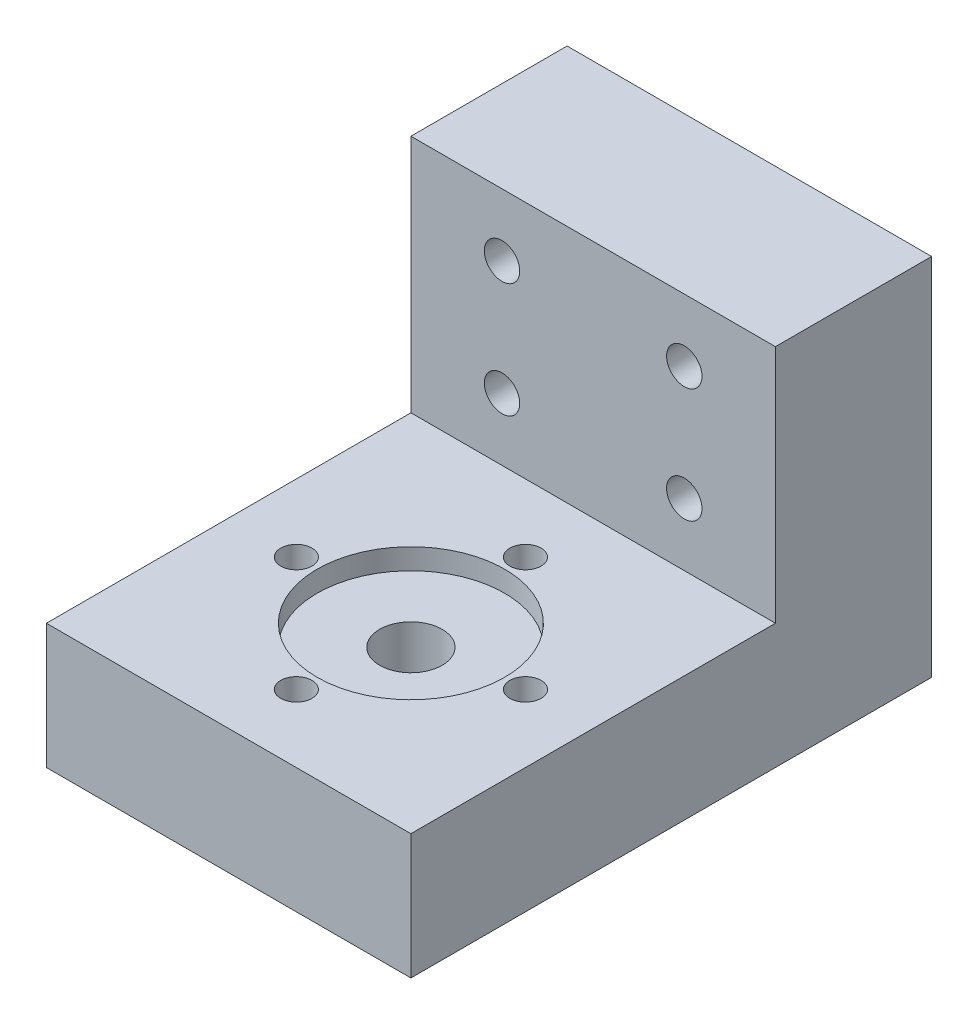
ISO-10303-21;
HEADER;
FILE_DESCRIPTION(('STEP AP214'),'2;1');
FILE_NAME('part.step','',(''),(''),'','','');
FILE_SCHEMA(('AUTOMOTIVE_DESIGN { 1 0 10303 214 1 1 1 1 }'));
ENDSEC;
DATA;
#1=APPLICATION_CONTEXT('core data for automotive mechanical design processes');
#2=APPLICATION_PROTOCOL_DEFINITION('international standard','automotive_design',2000,#1);
#3=PRODUCT_CONTEXT('',#1,'mechanical');
#4=PRODUCT('Part','Part','',(#3));
#5=PRODUCT_RELATED_PRODUCT_CATEGORY('part','',(#4));
#6=PRODUCT_DEFINITION_FORMATION('','',#4);
#7=PRODUCT_DEFINITION_CONTEXT('part definition',#1,'design');
#8=PRODUCT_DEFINITION('design','',#6,#7);
#9=PRODUCT_DEFINITION_SHAPE('','',#8);
#10=(LENGTH_UNIT() NAMED_UNIT(*) SI_UNIT(.MILLI.,.METRE.));
#11=(NAMED_UNIT(*) PLANE_ANGLE_UNIT() SI_UNIT($,.RADIAN.));
#12=(NAMED_UNIT(*) SI_UNIT($,.STERADIAN.) SOLID_ANGLE_UNIT());
#13=UNCERTAINTY_MEASURE_WITH_UNIT(LENGTH_MEASURE(1.E-05),#10,'distance_accuracy_value','');
#14=(GEOMETRIC_REPRESENTATION_CONTEXT(3) GLOBAL_UNCERTAINTY_ASSIGNED_CONTEXT((#13)) GLOBAL_UNIT_ASSIGNED_CONTEXT((#10,
#11,#12)) REPRESENTATION_CONTEXT('',''));
#15=CARTESIAN_POINT('',(0.,0.,0.));
#16=DIRECTION('',(0.,0.,1.));
#17=DIRECTION('',(1.,0.,0.));
#18=AXIS2_PLACEMENT_3D('',#15,#16,#17);
#19=CARTESIAN_POINT('',(0.,0.,15.));
#20=DIRECTION('',(0.,0.,-1.));
#21=DIRECTION('',(-1.,0.,0.));
#22=AXIS2_PLACEMENT_3D('',#19,#20,#21);
#23=PLANE('',#22);
#24=CARTESIAN_POINT('',(-8.75,11.5,15.));
#25=DIRECTION('',(0.,0.,1.));
#26=DIRECTION('',(1.,0.,0.));
#27=AXIS2_PLACEMENT_3D('',#24,#25,#26);
#28=CIRCLE('',#27,1.7);
#29=CARTESIAN_POINT('',(-7.05,11.5,15.));
#30=VERTEX_POINT('',#29);
#31=EDGE_CURVE('E397',#30,#30,#28,.T.);
#32=ORIENTED_EDGE('',*,*,#31,.F.);
#33=EDGE_LOOP('',(#32));
#34=FACE_BOUND('',#33,.T.);
#35=CARTESIAN_POINT('',(8.75,11.5,15.));
#36=DIRECTION('',(0.,0.,1.));
#37=DIRECTION('',(1.,0.,0.));
#38=AXIS2_PLACEMENT_3D('',#35,#36,#37);
#39=CIRCLE('',#38,1.7);
#40=CARTESIAN_POINT('',(10.45,11.5,15.));
#41=VERTEX_POINT('',#40);
#42=EDGE_CURVE('E401',#41,#41,#39,.T.);
#43=ORIENTED_EDGE('',*,*,#42,.F.);
#44=EDGE_LOOP('',(#43));
#45=FACE_BOUND('',#44,.T.);
#46=CARTESIAN_POINT('',(8.75,0.499999999999999,15.));
#47=DIRECTION('',(0.,0.,1.));
#48=DIRECTION('',(1.,0.,0.));
#49=AXIS2_PLACEMENT_3D('',#46,#47,#48);
#50=CIRCLE('',#49,1.7);
#51=CARTESIAN_POINT('',(10.45,0.499999999999999,15.));
#52=VERTEX_POINT('',#51);
#53=EDGE_CURVE('E409',#52,#52,#50,.T.);
#54=ORIENTED_EDGE('',*,*,#53,.F.);
#55=EDGE_LOOP('',(#54));
#56=FACE_BOUND('',#55,.T.);
#57=CARTESIAN_POINT('',(-8.75,0.499999999999999,15.));
#58=DIRECTION('',(0.,0.,1.));
#59=DIRECTION('',(1.,0.,0.));
#60=AXIS2_PLACEMENT_3D('',#57,#58,#59);
#61=CIRCLE('',#60,1.7);
#62=CARTESIAN_POINT('',(-7.05,0.499999999999999,15.));
#63=VERTEX_POINT('',#62);
#64=EDGE_CURVE('E203',#63,#63,#61,.T.);
#65=ORIENTED_EDGE('',*,*,#64,.F.);
#66=EDGE_LOOP('',(#65));
#67=FACE_BOUND('',#66,.T.);
#68=DIRECTION('',(-1.,0.,0.));
#69=VECTOR('',#68,1.);
#70=CARTESIAN_POINT('',(-17.5,-5.5,15.));
#71=LINE('',#70,#69);
#72=CARTESIAN_POINT('',(17.5,-5.5,15.));
#73=VERTEX_POINT('',#72);
#74=CARTESIAN_POINT('',(-17.5,-5.5,15.));
#75=VERTEX_POINT('',#74);
#76=EDGE_CURVE('E68',#73,#75,#71,.T.);
#77=ORIENTED_EDGE('',*,*,#76,.F.);
#78=DIRECTION('',(0.,1.,0.));
#79=VECTOR('',#78,1.);
#80=CARTESIAN_POINT('',(17.5,-17.5,15.));
#81=LINE('',#80,#79);
#82=CARTESIAN_POINT('',(17.5,17.5,15.));
#83=VERTEX_POINT('',#82);
#84=EDGE_CURVE('E106',#73,#83,#81,.T.);
#85=ORIENTED_EDGE('',*,*,#84,.T.);
#86=DIRECTION('',(-1.,0.,0.));
#87=VECTOR('',#86,1.);
#88=CARTESIAN_POINT('',(-17.5,17.5,15.));
#89=LINE('',#88,#87);
#90=CARTESIAN_POINT('',(-17.5,17.5,15.));
#91=VERTEX_POINT('',#90);
#92=EDGE_CURVE('E74',#83,#91,#89,.T.);
#93=ORIENTED_EDGE('',*,*,#92,.T.);
#94=DIRECTION('',(0.,-1.,0.));
#95=VECTOR('',#94,1.);
#96=CARTESIAN_POINT('',(-17.5,-17.5,15.));
#97=LINE('',#96,#95);
#98=EDGE_CURVE('E117',#91,#75,#97,.T.);
#99=ORIENTED_EDGE('',*,*,#98,.T.);
#100=EDGE_LOOP('',(#77,#85,#93,#99));
#101=FACE_BOUND('',#100,.T.);
#102=ADVANCED_FACE('F52',(#34,#45,#56,#67,#101),#23,.F.);
#103=CARTESIAN_POINT('',(17.5,-17.5,15.));
#104=DIRECTION('',(-1.,0.,0.));
#105=DIRECTION('',(0.,0.,1.));
#106=AXIS2_PLACEMENT_3D('',#103,#104,#105);
#107=PLANE('',#106);
#108=DIRECTION('',(0.,1.,0.));
#109=VECTOR('',#108,1.);
#110=CARTESIAN_POINT('',(17.5,-17.5,0.));
#111=LINE('',#110,#109);
#112=CARTESIAN_POINT('',(17.5,-17.5,0.));
#113=VERTEX_POINT('',#112);
#114=CARTESIAN_POINT('',(17.5,17.5,0.));
#115=VERTEX_POINT('',#114);
#116=EDGE_CURVE('E113',#113,#115,#111,.T.);
#117=ORIENTED_EDGE('',*,*,#116,.T.);
#118=DIRECTION('',(0.,0.,-1.));
#119=VECTOR('',#118,1.);
#120=CARTESIAN_POINT('',(17.5,17.5,15.));
#121=LINE('',#120,#119);
#122=EDGE_CURVE('E12',#83,#115,#121,.T.);
#123=ORIENTED_EDGE('',*,*,#122,.F.);
#124=ORIENTED_EDGE('',*,*,#84,.F.);
#125=DIRECTION('',(0.,0.,-1.));
#126=VECTOR('',#125,1.);
#127=CARTESIAN_POINT('',(17.5,-5.5,50.));
#128=LINE('',#127,#126);
#129=CARTESIAN_POINT('',(17.5,-5.5,50.));
#130=VERTEX_POINT('',#129);
#131=EDGE_CURVE('E121',#130,#73,#128,.T.);
#132=ORIENTED_EDGE('',*,*,#131,.F.);
#133=DIRECTION('',(0.,1.,0.));
#134=VECTOR('',#133,1.);
#135=CARTESIAN_POINT('',(17.5,-17.5,50.));
#136=LINE('',#135,#134);
#137=CARTESIAN_POINT('',(17.5,-17.5,50.));
#138=VERTEX_POINT('',#137);
#139=EDGE_CURVE('E116',#138,#130,#136,.T.);
#140=ORIENTED_EDGE('',*,*,#139,.F.);
#141=DIRECTION('',(0.,0.,-1.));
#142=VECTOR('',#141,1.);
#143=CARTESIAN_POINT('',(17.5,-17.5,15.));
#144=LINE('',#143,#142);
#145=EDGE_CURVE('E99',#138,#113,#144,.T.);
#146=ORIENTED_EDGE('',*,*,#145,.T.);
#147=EDGE_LOOP('',(#117,#123,#124,#132,#140,#146));
#148=FACE_BOUND('',#147,.T.);
#149=ADVANCED_FACE('F54',(#148),#107,.F.);
#150=CARTESIAN_POINT('',(-17.5,17.5,15.));
#151=DIRECTION('',(0.,-1.,0.));
#152=DIRECTION('',(0.,0.,-1.));
#153=AXIS2_PLACEMENT_3D('',#150,#151,#152);
#154=PLANE('',#153);
#155=DIRECTION('',(-1.,0.,0.));
#156=VECTOR('',#155,1.);
#157=CARTESIAN_POINT('',(-17.5,17.5,0.));
#158=LINE('',#157,#156);
#159=CARTESIAN_POINT('',(-17.5,17.5,0.));
#160=VERTEX_POINT('',#159);
#161=EDGE_CURVE('E120',#115,#160,#158,.T.);
#162=ORIENTED_EDGE('',*,*,#161,.T.);
#163=DIRECTION('',(0.,0.,-1.));
#164=VECTOR('',#163,1.);
#165=CARTESIAN_POINT('',(-17.5,17.5,15.));
#166=LINE('',#165,#164);
#167=EDGE_CURVE('E61',#91,#160,#166,.T.);
#168=ORIENTED_EDGE('',*,*,#167,.F.);
#169=ORIENTED_EDGE('',*,*,#92,.F.);
#170=ORIENTED_EDGE('',*,*,#122,.T.);
#171=EDGE_LOOP('',(#162,#168,#169,#170));
#172=FACE_BOUND('',#171,.T.);
#173=ADVANCED_FACE('F138',(#172),#154,.F.);
#174=CARTESIAN_POINT('',(-17.5,-17.5,15.));
#175=DIRECTION('',(1.,0.,0.));
#176=DIRECTION('',(0.,0.,-1.));
#177=AXIS2_PLACEMENT_3D('',#174,#175,#176);
#178=PLANE('',#177);
#179=DIRECTION('',(0.,-1.,0.));
#180=VECTOR('',#179,1.);
#181=CARTESIAN_POINT('',(-17.5,-17.5,0.));
#182=LINE('',#181,#180);
#183=CARTESIAN_POINT('',(-17.5,-17.5,0.));
#184=VERTEX_POINT('',#183);
#185=EDGE_CURVE('E107',#160,#184,#182,.T.);
#186=ORIENTED_EDGE('',*,*,#185,.T.);
#187=DIRECTION('',(0.,0.,-1.));
#188=VECTOR('',#187,1.);
#189=CARTESIAN_POINT('',(-17.5,-17.5,15.));
#190=LINE('',#189,#188);
#191=CARTESIAN_POINT('',(-17.5,-17.5,50.));
#192=VERTEX_POINT('',#191);
#193=EDGE_CURVE('E102',#192,#184,#190,.T.);
#194=ORIENTED_EDGE('',*,*,#193,.F.);
#195=DIRECTION('',(0.,-1.,0.));
#196=VECTOR('',#195,1.);
#197=CARTESIAN_POINT('',(-17.5,-17.5,50.));
#198=LINE('',#197,#196);
#199=CARTESIAN_POINT('',(-17.5,-5.5,50.));
#200=VERTEX_POINT('',#199);
#201=EDGE_CURVE('E158',#200,#192,#198,.T.);
#202=ORIENTED_EDGE('',*,*,#201,.F.);
#203=DIRECTION('',(0.,0.,-1.));
#204=VECTOR('',#203,1.);
#205=CARTESIAN_POINT('',(-17.5,-5.5,50.));
#206=LINE('',#205,#204);
#207=EDGE_CURVE('E125',#200,#75,#206,.T.);
#208=ORIENTED_EDGE('',*,*,#207,.T.);
#209=ORIENTED_EDGE('',*,*,#98,.F.);
#210=ORIENTED_EDGE('',*,*,#167,.T.);
#211=EDGE_LOOP('',(#186,#194,#202,#208,#209,#210));
#212=FACE_BOUND('',#211,.T.);
#213=ADVANCED_FACE('F135',(#212),#178,.F.);
#214=CARTESIAN_POINT('',(-17.5,-17.5,15.));
#215=DIRECTION('',(0.,1.,0.));
#216=DIRECTION('',(0.,0.,1.));
#217=AXIS2_PLACEMENT_3D('',#214,#215,#216);
#218=PLANE('',#217);
#219=CARTESIAN_POINT('',(0.,-17.5,21.5));
#220=DIRECTION('',(0.,1.,0.));
#221=DIRECTION('',(0.,0.,1.));
#222=AXIS2_PLACEMENT_3D('',#219,#220,#221);
#223=CIRCLE('',#222,1.5);
#224=CARTESIAN_POINT('',(0.,-17.5,23.));
#225=VERTEX_POINT('',#224);
#226=EDGE_CURVE('E176',#225,#225,#223,.T.);
#227=ORIENTED_EDGE('',*,*,#226,.T.);
#228=EDGE_LOOP('',(#227));
#229=FACE_BOUND('',#228,.T.);
#230=CARTESIAN_POINT('',(0.,-17.5,43.5));
#231=DIRECTION('',(0.,1.,0.));
#232=DIRECTION('',(0.,0.,-1.));
#233=AXIS2_PLACEMENT_3D('',#230,#231,#232);
#234=CIRCLE('',#233,1.5);
#235=CARTESIAN_POINT('',(0.,-17.5,42.));
#236=VERTEX_POINT('',#235);
#237=EDGE_CURVE('E211',#236,#236,#234,.T.);
#238=ORIENTED_EDGE('',*,*,#237,.T.);
#239=EDGE_LOOP('',(#238));
#240=FACE_BOUND('',#239,.T.);
#241=CARTESIAN_POINT('',(-11.,-17.5,32.5));
#242=DIRECTION('',(0.,1.,0.));
#243=DIRECTION('',(0.,0.,1.));
#244=AXIS2_PLACEMENT_3D('',#241,#242,#243);
#245=CIRCLE('',#244,1.5);
#246=CARTESIAN_POINT('',(-11.,-17.5,34.));
#247=VERTEX_POINT('',#246);
#248=EDGE_CURVE('E186',#247,#247,#245,.T.);
#249=ORIENTED_EDGE('',*,*,#248,.T.);
#250=EDGE_LOOP('',(#249));
#251=FACE_BOUND('',#250,.T.);
#252=CARTESIAN_POINT('',(11.,-17.5,32.5));
#253=DIRECTION('',(0.,1.,0.));
#254=DIRECTION('',(0.,0.,1.));
#255=AXIS2_PLACEMENT_3D('',#252,#253,#254);
#256=CIRCLE('',#255,1.5);
#257=CARTESIAN_POINT('',(11.,-17.5,34.));
#258=VERTEX_POINT('',#257);
#259=EDGE_CURVE('E177',#258,#258,#256,.T.);
#260=ORIENTED_EDGE('',*,*,#259,.T.);
#261=EDGE_LOOP('',(#260));
#262=FACE_BOUND('',#261,.T.);
#263=CARTESIAN_POINT('',(0.,-17.5,32.5));
#264=DIRECTION('',(0.,1.,0.));
#265=DIRECTION('',(0.,0.,1.));
#266=AXIS2_PLACEMENT_3D('',#263,#264,#265);
#267=CIRCLE('',#266,3.);
#268=CARTESIAN_POINT('',(0.,-17.5,35.5));
#269=VERTEX_POINT('',#268);
#270=EDGE_CURVE('E56',#269,#269,#267,.T.);
#271=ORIENTED_EDGE('',*,*,#270,.T.);
#272=EDGE_LOOP('',(#271));
#273=FACE_BOUND('',#272,.T.);
#274=DIRECTION('',(1.,0.,0.));
#275=VECTOR('',#274,1.);
#276=CARTESIAN_POINT('',(-17.5,-17.5,0.));
#277=LINE('',#276,#275);
#278=EDGE_CURVE('E94',#184,#113,#277,.T.);
#279=ORIENTED_EDGE('',*,*,#278,.T.);
#280=ORIENTED_EDGE('',*,*,#145,.F.);
#281=DIRECTION('',(1.,0.,0.));
#282=VECTOR('',#281,1.);
#283=CARTESIAN_POINT('',(-17.5,-17.5,50.));
#284=LINE('',#283,#282);
#285=EDGE_CURVE('E154',#192,#138,#284,.T.);
#286=ORIENTED_EDGE('',*,*,#285,.F.);
#287=ORIENTED_EDGE('',*,*,#193,.T.);
#288=EDGE_LOOP('',(#279,#280,#286,#287));
#289=FACE_BOUND('',#288,.T.);
#290=ADVANCED_FACE('F96',(#229,#240,#251,#262,#273,#289),#218,.F.);
#291=CARTESIAN_POINT('',(0.,0.,0.));
#292=DIRECTION('',(0.,0.,-1.));
#293=DIRECTION('',(-1.,0.,0.));
#294=AXIS2_PLACEMENT_3D('',#291,#292,#293);
#295=PLANE('',#294);
#296=CARTESIAN_POINT('',(-8.75,11.5,0.));
#297=DIRECTION('',(0.,0.,1.));
#298=DIRECTION('',(1.,0.,0.));
#299=AXIS2_PLACEMENT_3D('',#296,#297,#298);
#300=CIRCLE('',#299,1.7);
#301=CARTESIAN_POINT('',(-7.05,11.5,0.));
#302=VERTEX_POINT('',#301);
#303=EDGE_CURVE('E395',#302,#302,#300,.T.);
#304=ORIENTED_EDGE('',*,*,#303,.T.);
#305=EDGE_LOOP('',(#304));
#306=FACE_BOUND('',#305,.T.);
#307=CARTESIAN_POINT('',(8.75,11.5,0.));
#308=DIRECTION('',(0.,0.,1.));
#309=DIRECTION('',(1.,0.,0.));
#310=AXIS2_PLACEMENT_3D('',#307,#308,#309);
#311=CIRCLE('',#310,1.7);
#312=CARTESIAN_POINT('',(10.45,11.5,0.));
#313=VERTEX_POINT('',#312);
#314=EDGE_CURVE('E398',#313,#313,#311,.T.);
#315=ORIENTED_EDGE('',*,*,#314,.T.);
#316=EDGE_LOOP('',(#315));
#317=FACE_BOUND('',#316,.T.);
#318=CARTESIAN_POINT('',(8.75,0.499999999999999,0.));
#319=DIRECTION('',(0.,0.,1.));
#320=DIRECTION('',(1.,0.,0.));
#321=AXIS2_PLACEMENT_3D('',#318,#319,#320);
#322=CIRCLE('',#321,1.7);
#323=CARTESIAN_POINT('',(10.45,0.499999999999999,0.));
#324=VERTEX_POINT('',#323);
#325=EDGE_CURVE('E413',#324,#324,#322,.T.);
#326=ORIENTED_EDGE('',*,*,#325,.T.);
#327=EDGE_LOOP('',(#326));
#328=FACE_BOUND('',#327,.T.);
#329=CARTESIAN_POINT('',(-8.75,0.499999999999999,0.));
#330=DIRECTION('',(0.,0.,1.));
#331=DIRECTION('',(1.,0.,0.));
#332=AXIS2_PLACEMENT_3D('',#329,#330,#331);
#333=CIRCLE('',#332,1.7);
#334=CARTESIAN_POINT('',(-7.05,0.499999999999999,0.));
#335=VERTEX_POINT('',#334);
#336=EDGE_CURVE('E183',#335,#335,#333,.T.);
#337=ORIENTED_EDGE('',*,*,#336,.T.);
#338=EDGE_LOOP('',(#337));
#339=FACE_BOUND('',#338,.T.);
#340=ORIENTED_EDGE('',*,*,#116,.F.);
#341=ORIENTED_EDGE('',*,*,#278,.F.);
#342=ORIENTED_EDGE('',*,*,#185,.F.);
#343=ORIENTED_EDGE('',*,*,#161,.F.);
#344=EDGE_LOOP('',(#340,#341,#342,#343));
#345=FACE_BOUND('',#344,.T.);
#346=ADVANCED_FACE('F119',(#306,#317,#328,#339,#345),#295,.T.);
#347=CARTESIAN_POINT('',(-17.5,-5.5,50.));
#348=DIRECTION('',(0.,-1.,0.));
#349=DIRECTION('',(0.,0.,-1.));
#350=AXIS2_PLACEMENT_3D('',#347,#348,#349);
#351=PLANE('',#350);
#352=CARTESIAN_POINT('',(0.,-5.5,21.5));
#353=DIRECTION('',(0.,1.,0.));
#354=DIRECTION('',(0.,0.,1.));
#355=AXIS2_PLACEMENT_3D('',#352,#353,#354);
#356=CIRCLE('',#355,1.5);
#357=CARTESIAN_POINT('',(0.,-5.5,23.));
#358=VERTEX_POINT('',#357);
#359=EDGE_CURVE('E202',#358,#358,#356,.T.);
#360=ORIENTED_EDGE('',*,*,#359,.F.);
#361=EDGE_LOOP('',(#360));
#362=FACE_BOUND('',#361,.T.);
#363=CARTESIAN_POINT('',(0.,-5.5,43.5));
#364=DIRECTION('',(0.,1.,0.));
#365=DIRECTION('',(0.,0.,-1.));
#366=AXIS2_PLACEMENT_3D('',#363,#364,#365);
#367=CIRCLE('',#366,1.5);
#368=CARTESIAN_POINT('',(0.,-5.5,42.));
#369=VERTEX_POINT('',#368);
#370=EDGE_CURVE('E207',#369,#369,#367,.T.);
#371=ORIENTED_EDGE('',*,*,#370,.F.);
#372=EDGE_LOOP('',(#371));
#373=FACE_BOUND('',#372,.T.);
#374=CARTESIAN_POINT('',(-11.,-5.5,32.5));
#375=DIRECTION('',(0.,1.,0.));
#376=DIRECTION('',(0.,0.,1.));
#377=AXIS2_PLACEMENT_3D('',#374,#375,#376);
#378=CIRCLE('',#377,1.5);
#379=CARTESIAN_POINT('',(-11.,-5.5,34.));
#380=VERTEX_POINT('',#379);
#381=EDGE_CURVE('E191',#380,#380,#378,.T.);
#382=ORIENTED_EDGE('',*,*,#381,.F.);
#383=EDGE_LOOP('',(#382));
#384=FACE_BOUND('',#383,.T.);
#385=CARTESIAN_POINT('',(11.,-5.5,32.5));
#386=DIRECTION('',(0.,1.,0.));
#387=DIRECTION('',(0.,0.,1.));
#388=AXIS2_PLACEMENT_3D('',#385,#386,#387);
#389=CIRCLE('',#388,1.5);
#390=CARTESIAN_POINT('',(11.,-5.5,34.));
#391=VERTEX_POINT('',#390);
#392=EDGE_CURVE('E182',#391,#391,#389,.T.);
#393=ORIENTED_EDGE('',*,*,#392,.F.);
#394=EDGE_LOOP('',(#393));
#395=FACE_BOUND('',#394,.T.);
#396=CARTESIAN_POINT('',(0.,-5.5,32.5));
#397=DIRECTION('',(0.,1.,0.));
#398=DIRECTION('',(0.,0.,1.));
#399=AXIS2_PLACEMENT_3D('',#396,#397,#398);
#400=CIRCLE('',#399,9.);
#401=CARTESIAN_POINT('',(0.,-5.5,41.5));
#402=VERTEX_POINT('',#401);
#403=EDGE_CURVE('E168',#402,#402,#400,.T.);
#404=ORIENTED_EDGE('',*,*,#403,.F.);
#405=EDGE_LOOP('',(#404));
#406=FACE_BOUND('',#405,.T.);
#407=ORIENTED_EDGE('',*,*,#76,.T.);
#408=ORIENTED_EDGE('',*,*,#207,.F.);
#409=DIRECTION('',(-1.,0.,0.));
#410=VECTOR('',#409,1.);
#411=CARTESIAN_POINT('',(-17.5,-5.5,50.));
#412=LINE('',#411,#410);
#413=EDGE_CURVE('E147',#130,#200,#412,.T.);
#414=ORIENTED_EDGE('',*,*,#413,.F.);
#415=ORIENTED_EDGE('',*,*,#131,.T.);
#416=EDGE_LOOP('',(#407,#408,#414,#415));
#417=FACE_BOUND('',#416,.T.);
#418=ADVANCED_FACE('F143',(#362,#373,#384,#395,#406,#417),#351,.F.);
#419=CARTESIAN_POINT('',(0.,0.,50.));
#420=DIRECTION('',(0.,0.,-1.));
#421=DIRECTION('',(-1.,0.,0.));
#422=AXIS2_PLACEMENT_3D('',#419,#420,#421);
#423=PLANE('',#422);
#424=ORIENTED_EDGE('',*,*,#201,.T.);
#425=ORIENTED_EDGE('',*,*,#285,.T.);
#426=ORIENTED_EDGE('',*,*,#139,.T.);
#427=ORIENTED_EDGE('',*,*,#413,.T.);
#428=EDGE_LOOP('',(#424,#425,#426,#427));
#429=FACE_BOUND('',#428,.T.);
#430=ADVANCED_FACE('F165',(#429),#423,.F.);
#431=CARTESIAN_POINT('',(0.,-7.5,32.5));
#432=DIRECTION('',(0.,1.,0.));
#433=DIRECTION('',(0.,0.,1.));
#434=AXIS2_PLACEMENT_3D('',#431,#432,#433);
#435=CYLINDRICAL_SURFACE('',#434,9.);
#436=CARTESIAN_POINT('',(0.,-7.5,32.5));
#437=DIRECTION('',(0.,1.,0.));
#438=DIRECTION('',(0.,0.,1.));
#439=AXIS2_PLACEMENT_3D('',#436,#437,#438);
#440=CIRCLE('',#439,9.);
#441=CARTESIAN_POINT('',(0.,-7.5,41.5));
#442=VERTEX_POINT('',#441);
#443=EDGE_CURVE('E159',#442,#442,#440,.T.);
#444=ORIENTED_EDGE('',*,*,#443,.F.);
#445=EDGE_LOOP('',(#444));
#446=FACE_BOUND('',#445,.T.);
#447=ORIENTED_EDGE('',*,*,#403,.T.);
#448=EDGE_LOOP('',(#447));
#449=FACE_BOUND('',#448,.T.);
#450=ADVANCED_FACE('F230',(#446,#449),#435,.F.);
#451=CARTESIAN_POINT('',(0.,-7.5,32.5));
#452=DIRECTION('',(0.,1.,0.));
#453=DIRECTION('',(0.,0.,1.));
#454=AXIS2_PLACEMENT_3D('',#451,#452,#453);
#455=PLANE('',#454);
#456=CARTESIAN_POINT('',(0.,-7.5,32.5));
#457=DIRECTION('',(0.,1.,0.));
#458=DIRECTION('',(0.,0.,1.));
#459=AXIS2_PLACEMENT_3D('',#456,#457,#458);
#460=CIRCLE('',#459,3.);
#461=CARTESIAN_POINT('',(0.,-7.5,35.5));
#462=VERTEX_POINT('',#461);
#463=EDGE_CURVE('E174',#462,#462,#460,.T.);
#464=ORIENTED_EDGE('',*,*,#463,.F.);
#465=EDGE_LOOP('',(#464));
#466=FACE_BOUND('',#465,.T.);
#467=ORIENTED_EDGE('',*,*,#443,.T.);
#468=EDGE_LOOP('',(#467));
#469=FACE_BOUND('',#468,.T.);
#470=ADVANCED_FACE('F232',(#466,#469),#455,.T.);
#471=CARTESIAN_POINT('',(0.,-21.5,32.5));
#472=DIRECTION('',(0.,1.,0.));
#473=DIRECTION('',(0.,0.,1.));
#474=AXIS2_PLACEMENT_3D('',#471,#472,#473);
#475=CYLINDRICAL_SURFACE('',#474,3.);
#476=ORIENTED_EDGE('',*,*,#463,.T.);
#477=EDGE_LOOP('',(#476));
#478=FACE_BOUND('',#477,.T.);
#479=ORIENTED_EDGE('',*,*,#270,.F.);
#480=EDGE_LOOP('',(#479));
#481=FACE_BOUND('',#480,.T.);
#482=ADVANCED_FACE('F237',(#478,#481),#475,.F.);
#483=CARTESIAN_POINT('',(11.,-17.5,32.5));
#484=DIRECTION('',(0.,1.,0.));
#485=DIRECTION('',(0.,0.,1.));
#486=AXIS2_PLACEMENT_3D('',#483,#484,#485);
#487=CYLINDRICAL_SURFACE('',#486,1.5);
#488=ORIENTED_EDGE('',*,*,#259,.F.);
#489=EDGE_LOOP('',(#488));
#490=FACE_BOUND('',#489,.T.);
#491=ORIENTED_EDGE('',*,*,#392,.T.);
#492=EDGE_LOOP('',(#491));
#493=FACE_BOUND('',#492,.T.);
#494=ADVANCED_FACE('F300',(#490,#493),#487,.F.);
#495=CARTESIAN_POINT('',(-11.,-17.5,32.5));
#496=DIRECTION('',(0.,1.,0.));
#497=DIRECTION('',(0.,0.,1.));
#498=AXIS2_PLACEMENT_3D('',#495,#496,#497);
#499=CYLINDRICAL_SURFACE('',#498,1.5);
#500=ORIENTED_EDGE('',*,*,#248,.F.);
#501=EDGE_LOOP('',(#500));
#502=FACE_BOUND('',#501,.T.);
#503=ORIENTED_EDGE('',*,*,#381,.T.);
#504=EDGE_LOOP('',(#503));
#505=FACE_BOUND('',#504,.T.);
#506=ADVANCED_FACE('F220',(#502,#505),#499,.F.);
#507=CARTESIAN_POINT('',(0.,-17.5,43.5));
#508=DIRECTION('',(0.,1.,0.));
#509=DIRECTION('',(0.,0.,1.));
#510=AXIS2_PLACEMENT_3D('',#507,#508,#509);
#511=CYLINDRICAL_SURFACE('',#510,1.5);
#512=ORIENTED_EDGE('',*,*,#237,.F.);
#513=EDGE_LOOP('',(#512));
#514=FACE_BOUND('',#513,.T.);
#515=ORIENTED_EDGE('',*,*,#370,.T.);
#516=EDGE_LOOP('',(#515));
#517=FACE_BOUND('',#516,.T.);
#518=ADVANCED_FACE('F330',(#514,#517),#511,.F.);
#519=CARTESIAN_POINT('',(0.,-17.5,21.5));
#520=DIRECTION('',(0.,1.,0.));
#521=DIRECTION('',(0.,0.,1.));
#522=AXIS2_PLACEMENT_3D('',#519,#520,#521);
#523=CYLINDRICAL_SURFACE('',#522,1.5);
#524=ORIENTED_EDGE('',*,*,#226,.F.);
#525=EDGE_LOOP('',(#524));
#526=FACE_BOUND('',#525,.T.);
#527=ORIENTED_EDGE('',*,*,#359,.T.);
#528=EDGE_LOOP('',(#527));
#529=FACE_BOUND('',#528,.T.);
#530=ADVANCED_FACE('F338',(#526,#529),#523,.F.);
#531=CARTESIAN_POINT('',(-8.75,0.499999999999999,0.));
#532=DIRECTION('',(0.,0.,1.));
#533=DIRECTION('',(1.,0.,0.));
#534=AXIS2_PLACEMENT_3D('',#531,#532,#533);
#535=CYLINDRICAL_SURFACE('',#534,1.7);
#536=ORIENTED_EDGE('',*,*,#336,.F.);
#537=EDGE_LOOP('',(#536));
#538=FACE_BOUND('',#537,.T.);
#539=ORIENTED_EDGE('',*,*,#64,.T.);
#540=EDGE_LOOP('',(#539));
#541=FACE_BOUND('',#540,.T.);
#542=ADVANCED_FACE('F346',(#538,#541),#535,.F.);
#543=CARTESIAN_POINT('',(8.75,0.499999999999999,0.));
#544=DIRECTION('',(0.,0.,1.));
#545=DIRECTION('',(1.,0.,0.));
#546=AXIS2_PLACEMENT_3D('',#543,#544,#545);
#547=CYLINDRICAL_SURFACE('',#546,1.7);
#548=ORIENTED_EDGE('',*,*,#325,.F.);
#549=EDGE_LOOP('',(#548));
#550=FACE_BOUND('',#549,.T.);
#551=ORIENTED_EDGE('',*,*,#53,.T.);
#552=EDGE_LOOP('',(#551));
#553=FACE_BOUND('',#552,.T.);
#554=ADVANCED_FACE('F359',(#550,#553),#547,.F.);
#555=CARTESIAN_POINT('',(8.75,11.5,0.));
#556=DIRECTION('',(0.,0.,1.));
#557=DIRECTION('',(1.,0.,0.));
#558=AXIS2_PLACEMENT_3D('',#555,#556,#557);
#559=CYLINDRICAL_SURFACE('',#558,1.7);
#560=ORIENTED_EDGE('',*,*,#314,.F.);
#561=EDGE_LOOP('',(#560));
#562=FACE_BOUND('',#561,.T.);
#563=ORIENTED_EDGE('',*,*,#42,.T.);
#564=EDGE_LOOP('',(#563));
#565=FACE_BOUND('',#564,.T.);
#566=ADVANCED_FACE('F369',(#562,#565),#559,.F.);
#567=CARTESIAN_POINT('',(-8.75,11.5,0.));
#568=DIRECTION('',(0.,0.,1.));
#569=DIRECTION('',(1.,0.,0.));
#570=AXIS2_PLACEMENT_3D('',#567,#568,#569);
#571=CYLINDRICAL_SURFACE('',#570,1.7);
#572=ORIENTED_EDGE('',*,*,#303,.F.);
#573=EDGE_LOOP('',(#572));
#574=FACE_BOUND('',#573,.T.);
#575=ORIENTED_EDGE('',*,*,#31,.T.);
#576=EDGE_LOOP('',(#575));
#577=FACE_BOUND('',#576,.T.);
#578=ADVANCED_FACE('F379',(#574,#577),#571,.F.);
#579=CLOSED_SHELL('',(#102,#149,#173,#213,#290,#346,#418,#430,#450,#470,#482,#494,#506,#518,
#530,#542,#554,#566,#578));
#580=MANIFOLD_SOLID_BREP('B2',#579);
#581=ADVANCED_BREP_SHAPE_REPRESENTATION('',(#18,#580),#14);
#582=SHAPE_DEFINITION_REPRESENTATION(#9,#581);
ENDSEC;
END-ISO-10303-21;
